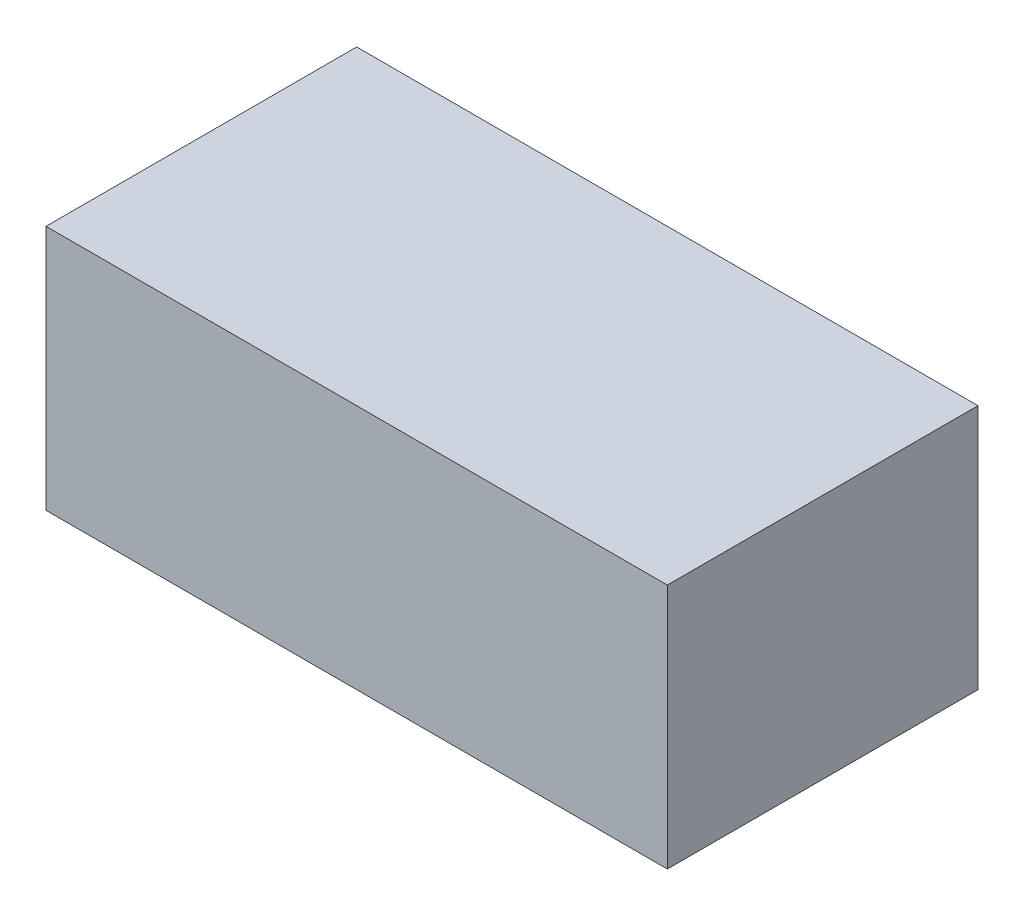
ISO-10303-21;
HEADER;
FILE_DESCRIPTION(('STEP AP214'),'2;1');
FILE_NAME('part.step','',(''),(''),'','','');
FILE_SCHEMA(('AUTOMOTIVE_DESIGN { 1 0 10303 214 1 1 1 1 }'));
ENDSEC;
DATA;
#1=APPLICATION_CONTEXT('core data for automotive mechanical design processes');
#2=APPLICATION_PROTOCOL_DEFINITION('international standard','automotive_design',2000,#1);
#3=PRODUCT_CONTEXT('',#1,'mechanical');
#4=PRODUCT('Part','Part','',(#3));
#5=PRODUCT_RELATED_PRODUCT_CATEGORY('part','',(#4));
#6=PRODUCT_DEFINITION_FORMATION('','',#4);
#7=PRODUCT_DEFINITION_CONTEXT('part definition',#1,'design');
#8=PRODUCT_DEFINITION('design','',#6,#7);
#9=PRODUCT_DEFINITION_SHAPE('','',#8);
#10=(LENGTH_UNIT() NAMED_UNIT(*) SI_UNIT(.MILLI.,.METRE.));
#11=(NAMED_UNIT(*) PLANE_ANGLE_UNIT() SI_UNIT($,.RADIAN.));
#12=(NAMED_UNIT(*) SI_UNIT($,.STERADIAN.) SOLID_ANGLE_UNIT());
#13=UNCERTAINTY_MEASURE_WITH_UNIT(LENGTH_MEASURE(1.E-05),#10,'distance_accuracy_value','');
#14=(GEOMETRIC_REPRESENTATION_CONTEXT(3) GLOBAL_UNCERTAINTY_ASSIGNED_CONTEXT((#13)) GLOBAL_UNIT_ASSIGNED_CONTEXT((#10,
#11,#12)) REPRESENTATION_CONTEXT('',''));
#15=CARTESIAN_POINT('',(0.,0.,0.));
#16=DIRECTION('',(0.,0.,1.));
#17=DIRECTION('',(1.,0.,0.));
#18=AXIS2_PLACEMENT_3D('',#15,#16,#17);
#19=CARTESIAN_POINT('',(0.,1.9,0.));
#20=DIRECTION('',(1.,0.,0.));
#21=DIRECTION('',(0.,0.,-1.));
#22=AXIS2_PLACEMENT_3D('',#19,#20,#21);
#23=PLANE('',#22);
#24=DIRECTION('',(0.,0.,1.));
#25=VECTOR('',#24,1.);
#26=CARTESIAN_POINT('',(0.,0.,0.));
#27=LINE('',#26,#25);
#28=CARTESIAN_POINT('',(0.,0.,-2.4));
#29=VERTEX_POINT('',#28);
#30=CARTESIAN_POINT('',(0.,0.,0.));
#31=VERTEX_POINT('',#30);
#32=EDGE_CURVE('E112',#29,#31,#27,.T.);
#33=ORIENTED_EDGE('',*,*,#32,.T.);
#34=DIRECTION('',(0.,-1.,0.));
#35=VECTOR('',#34,1.);
#36=CARTESIAN_POINT('',(0.,1.9,0.));
#37=LINE('',#36,#35);
#38=CARTESIAN_POINT('',(0.,1.9,0.));
#39=VERTEX_POINT('',#38);
#40=EDGE_CURVE('E11',#39,#31,#37,.T.);
#41=ORIENTED_EDGE('',*,*,#40,.F.);
#42=DIRECTION('',(0.,0.,1.));
#43=VECTOR('',#42,1.);
#44=CARTESIAN_POINT('',(0.,1.9,0.));
#45=LINE('',#44,#43);
#46=CARTESIAN_POINT('',(0.,1.9,-2.4));
#47=VERTEX_POINT('',#46);
#48=EDGE_CURVE('E95',#47,#39,#45,.T.);
#49=ORIENTED_EDGE('',*,*,#48,.F.);
#50=DIRECTION('',(0.,-1.,0.));
#51=VECTOR('',#50,1.);
#52=CARTESIAN_POINT('',(0.,1.9,-2.4));
#53=LINE('',#52,#51);
#54=EDGE_CURVE('E108',#47,#29,#53,.T.);
#55=ORIENTED_EDGE('',*,*,#54,.T.);
#56=EDGE_LOOP('',(#33,#41,#49,#55));
#57=FACE_BOUND('',#56,.T.);
#58=ADVANCED_FACE('F43',(#57),#23,.F.);
#59=CARTESIAN_POINT('',(0.,1.9,0.));
#60=DIRECTION('',(0.,0.,-1.));
#61=DIRECTION('',(-1.,0.,0.));
#62=AXIS2_PLACEMENT_3D('',#59,#60,#61);
#63=PLANE('',#62);
#64=DIRECTION('',(1.,0.,0.));
#65=VECTOR('',#64,1.);
#66=CARTESIAN_POINT('',(0.,0.,0.));
#67=LINE('',#66,#65);
#68=CARTESIAN_POINT('',(4.8,0.,0.));
#69=VERTEX_POINT('',#68);
#70=EDGE_CURVE('E100',#31,#69,#67,.T.);
#71=ORIENTED_EDGE('',*,*,#70,.T.);
#72=DIRECTION('',(0.,-1.,0.));
#73=VECTOR('',#72,1.);
#74=CARTESIAN_POINT('',(4.8,1.9,0.));
#75=LINE('',#74,#73);
#76=CARTESIAN_POINT('',(4.8,1.9,0.));
#77=VERTEX_POINT('',#76);
#78=EDGE_CURVE('E52',#77,#69,#75,.T.);
#79=ORIENTED_EDGE('',*,*,#78,.F.);
#80=DIRECTION('',(1.,0.,0.));
#81=VECTOR('',#80,1.);
#82=CARTESIAN_POINT('',(0.,1.9,0.));
#83=LINE('',#82,#81);
#84=EDGE_CURVE('E90',#39,#77,#83,.T.);
#85=ORIENTED_EDGE('',*,*,#84,.F.);
#86=ORIENTED_EDGE('',*,*,#40,.T.);
#87=EDGE_LOOP('',(#71,#79,#85,#86));
#88=FACE_BOUND('',#87,.T.);
#89=ADVANCED_FACE('F99',(#88),#63,.F.);
#90=CARTESIAN_POINT('',(4.8,1.9,0.));
#91=DIRECTION('',(-1.,0.,0.));
#92=DIRECTION('',(0.,0.,1.));
#93=AXIS2_PLACEMENT_3D('',#90,#91,#92);
#94=PLANE('',#93);
#95=DIRECTION('',(0.,0.,-1.));
#96=VECTOR('',#95,1.);
#97=CARTESIAN_POINT('',(4.8,0.,0.));
#98=LINE('',#97,#96);
#99=CARTESIAN_POINT('',(4.8,0.,-2.4));
#100=VERTEX_POINT('',#99);
#101=EDGE_CURVE('E77',#69,#100,#98,.T.);
#102=ORIENTED_EDGE('',*,*,#101,.T.);
#103=DIRECTION('',(0.,-1.,0.));
#104=VECTOR('',#103,1.);
#105=CARTESIAN_POINT('',(4.8,1.9,-2.4));
#106=LINE('',#105,#104);
#107=CARTESIAN_POINT('',(4.8,1.9,-2.4));
#108=VERTEX_POINT('',#107);
#109=EDGE_CURVE('E102',#108,#100,#106,.T.);
#110=ORIENTED_EDGE('',*,*,#109,.F.);
#111=DIRECTION('',(0.,0.,-1.));
#112=VECTOR('',#111,1.);
#113=CARTESIAN_POINT('',(4.8,1.9,0.));
#114=LINE('',#113,#112);
#115=EDGE_CURVE('E93',#77,#108,#114,.T.);
#116=ORIENTED_EDGE('',*,*,#115,.F.);
#117=ORIENTED_EDGE('',*,*,#78,.T.);
#118=EDGE_LOOP('',(#102,#110,#116,#117));
#119=FACE_BOUND('',#118,.T.);
#120=ADVANCED_FACE('F103',(#119),#94,.F.);
#121=CARTESIAN_POINT('',(0.,1.9,-2.4));
#122=DIRECTION('',(0.,0.,1.));
#123=DIRECTION('',(1.,0.,0.));
#124=AXIS2_PLACEMENT_3D('',#121,#122,#123);
#125=PLANE('',#124);
#126=DIRECTION('',(-1.,0.,0.));
#127=VECTOR('',#126,1.);
#128=CARTESIAN_POINT('',(0.,0.,-2.4));
#129=LINE('',#128,#127);
#130=EDGE_CURVE('E83',#100,#29,#129,.T.);
#131=ORIENTED_EDGE('',*,*,#130,.T.);
#132=ORIENTED_EDGE('',*,*,#54,.F.);
#133=DIRECTION('',(-1.,0.,0.));
#134=VECTOR('',#133,1.);
#135=CARTESIAN_POINT('',(0.,1.9,-2.4));
#136=LINE('',#135,#134);
#137=EDGE_CURVE('E60',#108,#47,#136,.T.);
#138=ORIENTED_EDGE('',*,*,#137,.F.);
#139=ORIENTED_EDGE('',*,*,#109,.T.);
#140=EDGE_LOOP('',(#131,#132,#138,#139));
#141=FACE_BOUND('',#140,.T.);
#142=ADVANCED_FACE('F125',(#141),#125,.F.);
#143=CARTESIAN_POINT('',(0.,1.9,0.));
#144=DIRECTION('',(0.,-1.,0.));
#145=DIRECTION('',(0.,0.,-1.));
#146=AXIS2_PLACEMENT_3D('',#143,#144,#145);
#147=PLANE('',#146);
#148=ORIENTED_EDGE('',*,*,#48,.T.);
#149=ORIENTED_EDGE('',*,*,#84,.T.);
#150=ORIENTED_EDGE('',*,*,#115,.T.);
#151=ORIENTED_EDGE('',*,*,#137,.T.);
#152=EDGE_LOOP('',(#148,#149,#150,#151));
#153=FACE_BOUND('',#152,.T.);
#154=ADVANCED_FACE('F91',(#153),#147,.F.);
#155=CARTESIAN_POINT('',(0.,0.,0.));
#156=DIRECTION('',(0.,-1.,0.));
#157=DIRECTION('',(0.,0.,-1.));
#158=AXIS2_PLACEMENT_3D('',#155,#156,#157);
#159=PLANE('',#158);
#160=ORIENTED_EDGE('',*,*,#32,.F.);
#161=ORIENTED_EDGE('',*,*,#130,.F.);
#162=ORIENTED_EDGE('',*,*,#101,.F.);
#163=ORIENTED_EDGE('',*,*,#70,.F.);
#164=EDGE_LOOP('',(#160,#161,#162,#163));
#165=FACE_BOUND('',#164,.T.);
#166=ADVANCED_FACE('F128',(#165),#159,.T.);
#167=CLOSED_SHELL('',(#58,#89,#120,#142,#154,#166));
#168=MANIFOLD_SOLID_BREP('B2',#167);
#169=ADVANCED_BREP_SHAPE_REPRESENTATION('',(#18,#168),#14);
#170=SHAPE_DEFINITION_REPRESENTATION(#9,#169);
ENDSEC;
END-ISO-10303-21;
